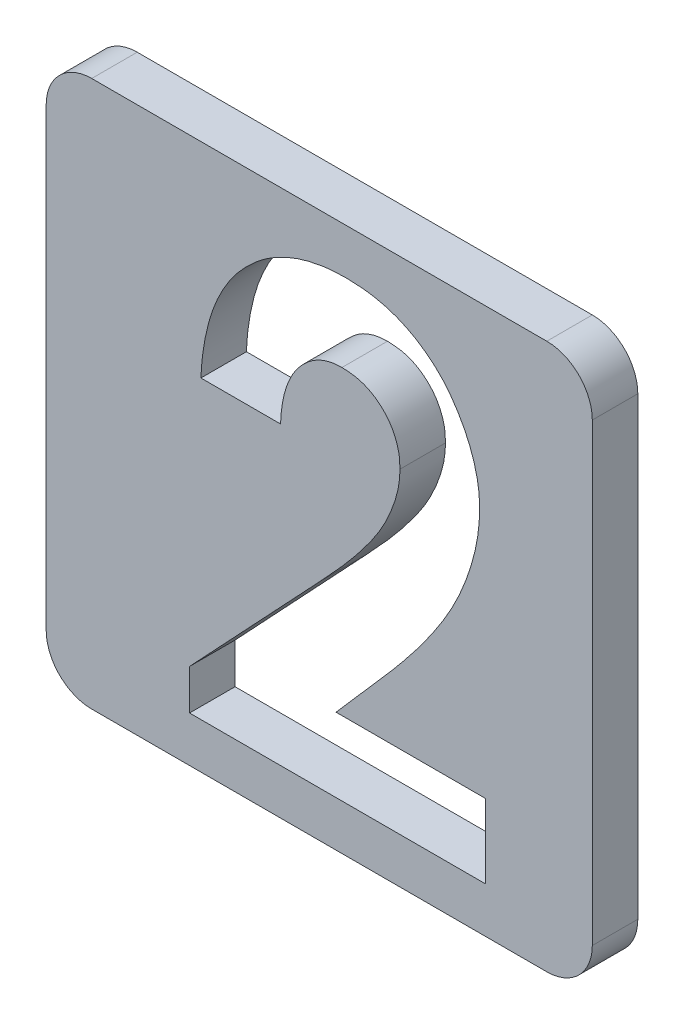
ISO-10303-21;
HEADER;
FILE_DESCRIPTION(('STEP AP214'),'2;1');
FILE_NAME('part.step','',(''),(''),'','','');
FILE_SCHEMA(('AUTOMOTIVE_DESIGN { 1 0 10303 214 1 1 1 1 }'));
ENDSEC;
DATA;
#1=APPLICATION_CONTEXT('core data for automotive mechanical design processes');
#2=APPLICATION_PROTOCOL_DEFINITION('international standard','automotive_design',2000,#1);
#3=PRODUCT_CONTEXT('',#1,'mechanical');
#4=PRODUCT('Part','Part','',(#3));
#5=PRODUCT_RELATED_PRODUCT_CATEGORY('part','',(#4));
#6=PRODUCT_DEFINITION_FORMATION('','',#4);
#7=PRODUCT_DEFINITION_CONTEXT('part definition',#1,'design');
#8=PRODUCT_DEFINITION('design','',#6,#7);
#9=PRODUCT_DEFINITION_SHAPE('','',#8);
#10=(LENGTH_UNIT() NAMED_UNIT(*) SI_UNIT(.MILLI.,.METRE.));
#11=(NAMED_UNIT(*) PLANE_ANGLE_UNIT() SI_UNIT($,.RADIAN.));
#12=(NAMED_UNIT(*) SI_UNIT($,.STERADIAN.) SOLID_ANGLE_UNIT());
#13=UNCERTAINTY_MEASURE_WITH_UNIT(LENGTH_MEASURE(1.E-05),#10,'distance_accuracy_value','');
#14=(GEOMETRIC_REPRESENTATION_CONTEXT(3) GLOBAL_UNCERTAINTY_ASSIGNED_CONTEXT((#13)) GLOBAL_UNIT_ASSIGNED_CONTEXT((#10,
#11,#12)) REPRESENTATION_CONTEXT('',''));
#15=CARTESIAN_POINT('',(0.,0.,0.));
#16=DIRECTION('',(0.,0.,1.));
#17=DIRECTION('',(1.,0.,0.));
#18=AXIS2_PLACEMENT_3D('',#15,#16,#17);
#19=CARTESIAN_POINT('',(50.,50.,10.));
#20=DIRECTION('',(0.,0.,-1.));
#21=DIRECTION('',(-1.,0.,0.));
#22=AXIS2_PLACEMENT_3D('',#19,#20,#21);
#23=PLANE('',#22);
#24=DIRECTION('',(1.,0.,0.));
#25=VECTOR('',#24,1.);
#26=CARTESIAN_POINT('',(-49.9999999999999,60.,10.));
#27=LINE('',#26,#25);
#28=CARTESIAN_POINT('',(-49.9999999999999,60.,10.));
#29=VERTEX_POINT('',#28);
#30=CARTESIAN_POINT('',(49.9999999999999,60.,10.));
#31=VERTEX_POINT('',#30);
#32=EDGE_CURVE('E293',#29,#31,#27,.T.);
#33=ORIENTED_EDGE('',*,*,#32,.F.);
#34=CARTESIAN_POINT('',(-50.,50.,10.));
#35=DIRECTION('',(0.,0.,1.));
#36=DIRECTION('',(1.,0.,0.));
#37=AXIS2_PLACEMENT_3D('',#34,#35,#36);
#38=CIRCLE('',#37,10.);
#39=CARTESIAN_POINT('',(-60.,49.9999999999999,10.));
#40=VERTEX_POINT('',#39);
#41=EDGE_CURVE('E280',#29,#40,#38,.T.);
#42=ORIENTED_EDGE('',*,*,#41,.T.);
#43=DIRECTION('',(0.,-1.,0.));
#44=VECTOR('',#43,1.);
#45=CARTESIAN_POINT('',(-60.,49.9999999999999,10.));
#46=LINE('',#45,#44);
#47=CARTESIAN_POINT('',(-60.,-49.9999999999999,10.));
#48=VERTEX_POINT('',#47);
#49=EDGE_CURVE('E308',#40,#48,#46,.T.);
#50=ORIENTED_EDGE('',*,*,#49,.T.);
#51=CARTESIAN_POINT('',(-50.,-50.,10.));
#52=DIRECTION('',(0.,0.,1.));
#53=DIRECTION('',(1.,0.,0.));
#54=AXIS2_PLACEMENT_3D('',#51,#52,#53);
#55=CIRCLE('',#54,10.);
#56=CARTESIAN_POINT('',(-49.9999999999999,-60.,10.));
#57=VERTEX_POINT('',#56);
#58=EDGE_CURVE('E312',#48,#57,#55,.T.);
#59=ORIENTED_EDGE('',*,*,#58,.T.);
#60=DIRECTION('',(1.,0.,0.));
#61=VECTOR('',#60,1.);
#62=CARTESIAN_POINT('',(-49.9999999999999,-60.,10.));
#63=LINE('',#62,#61);
#64=CARTESIAN_POINT('',(49.9999999999999,-60.,10.));
#65=VERTEX_POINT('',#64);
#66=EDGE_CURVE('E315',#57,#65,#63,.T.);
#67=ORIENTED_EDGE('',*,*,#66,.T.);
#68=CARTESIAN_POINT('',(50.,-50.,10.));
#69=DIRECTION('',(0.,0.,1.));
#70=DIRECTION('',(1.,0.,0.));
#71=AXIS2_PLACEMENT_3D('',#68,#69,#70);
#72=CIRCLE('',#71,10.);
#73=CARTESIAN_POINT('',(60.,-50.,10.));
#74=VERTEX_POINT('',#73);
#75=EDGE_CURVE('E319',#65,#74,#72,.T.);
#76=ORIENTED_EDGE('',*,*,#75,.T.);
#77=DIRECTION('',(0.,-1.,0.));
#78=VECTOR('',#77,1.);
#79=CARTESIAN_POINT('',(60.,49.9999999999999,10.));
#80=LINE('',#79,#78);
#81=CARTESIAN_POINT('',(60.,49.9999999999999,10.));
#82=VERTEX_POINT('',#81);
#83=EDGE_CURVE('E321',#82,#74,#80,.T.);
#84=ORIENTED_EDGE('',*,*,#83,.F.);
#85=CARTESIAN_POINT('',(50.,50.,10.));
#86=DIRECTION('',(0.,0.,-1.));
#87=DIRECTION('',(-1.,0.,0.));
#88=AXIS2_PLACEMENT_3D('',#85,#86,#87);
#89=CIRCLE('',#88,10.);
#90=EDGE_CURVE('E324',#31,#82,#89,.T.);
#91=ORIENTED_EDGE('',*,*,#90,.F.);
#92=EDGE_LOOP('',(#33,#42,#50,#59,#67,#76,#84,#91));
#93=FACE_BOUND('',#92,.T.);
#94=CARTESIAN_POINT('',(4.99609375,32.5,10.));
#95=CARTESIAN_POINT('',(4.53312483436699,32.4836250197315,10.));
#96=CARTESIAN_POINT('',(3.62169617498065,32.451388241387,10.));
#97=CARTESIAN_POINT('',(2.28196728534199,32.2367967300344,10.));
#98=CARTESIAN_POINT('',(1.00711899457204,31.8586015906494,10.));
#99=CARTESIAN_POINT('',(-0.217038468215524,31.3518733346072,10.));
#100=CARTESIAN_POINT('',(-1.37744057242677,30.680201393142,10.));
#101=CARTESIAN_POINT('',(-2.47116041632915,29.8522587146512,10.));
#102=CARTESIAN_POINT('',(-3.5097217204736,28.8890852036434,10.));
#103=CARTESIAN_POINT('',(-4.48836122605921,27.7936925758525,10.));
#104=CARTESIAN_POINT('',(-5.3790509329746,26.5712340817525,10.));
#105=CARTESIAN_POINT('',(-6.17015827377722,25.2328743797815,10.));
#106=CARTESIAN_POINT('',(-6.82427234510946,23.7794442295601,10.));
#107=CARTESIAN_POINT('',(-7.4001781477211,22.2301311290651,10.));
#108=CARTESIAN_POINT('',(-7.84434426039038,20.568294192624,10.));
#109=CARTESIAN_POINT('',(-8.16775229100981,18.8038793287482,10.));
#110=CARTESIAN_POINT('',(-8.41361781946333,16.939757009579,10.));
#111=CARTESIAN_POINT('',(-8.47068212505859,15.6583482041116,10.));
#112=CARTESIAN_POINT('',(-8.5,15.,10.));
#113=B_SPLINE_CURVE_WITH_KNOTS('',3,(#94,#95,#96,#97,#98,#99,#100,#101,#102,#103,#104,#105,#106,
#107,#108,#109,#110,#111,#112),.UNSPECIFIED.,.F.,.F.,(4,1,1,1,1,1,1,1,1,1,1,1,1,1,1,1,4),(0.,
0.0564668684718626,0.111164098696963,0.164937096875985,0.218321752312594,0.272392923248277,
0.327976343447704,0.385291051984021,0.444902918292819,0.506843819219835,0.569488185262968,
0.634153215553722,0.70097609531005,0.770897496846268,0.843625610555779,0.91965967611554,1.),.UNSPECIFIED.);
#114=CARTESIAN_POINT('',(4.99609375,32.5,10.));
#115=VERTEX_POINT('',#114);
#116=CARTESIAN_POINT('',(-8.5,15.,10.));
#117=VERTEX_POINT('',#116);
#118=EDGE_CURVE('E49',#115,#117,#113,.T.);
#119=ORIENTED_EDGE('',*,*,#118,.T.);
#120=DIRECTION('',(-1.,0.,0.));
#121=VECTOR('',#120,1.);
#122=CARTESIAN_POINT('',(-8.5,15.,10.));
#123=LINE('',#122,#121);
#124=CARTESIAN_POINT('',(-26.,15.,10.));
#125=VERTEX_POINT('',#124);
#126=EDGE_CURVE('E191',#117,#125,#123,.T.);
#127=ORIENTED_EDGE('',*,*,#126,.T.);
#128=CARTESIAN_POINT('',(-26.,15.,10.));
#129=CARTESIAN_POINT('',(-25.9244201838948,16.3237824174447,10.));
#130=CARTESIAN_POINT('',(-25.7767417610058,18.9103737817913,10.));
#131=CARTESIAN_POINT('',(-25.1893143204155,22.6674805607774,10.));
#132=CARTESIAN_POINT('',(-24.4021817098028,26.2175333190287,10.));
#133=CARTESIAN_POINT('',(-23.3516487477795,29.5481135851914,10.));
#134=CARTESIAN_POINT('',(-22.0315853430169,32.6580111334457,10.));
#135=CARTESIAN_POINT('',(-20.4759601281893,35.5578277739389,10.));
#136=CARTESIAN_POINT('',(-18.6450304131101,38.2322959078053,10.));
#137=CARTESIAN_POINT('',(-16.5777644037318,40.6685177399648,10.));
#138=CARTESIAN_POINT('',(-14.3092585900131,42.854074826766,10.));
#139=CARTESIAN_POINT('',(-11.8866093801282,44.7919270427031,10.));
#140=CARTESIAN_POINT('',(-9.272759089537,46.3909939220441,10.));
#141=CARTESIAN_POINT('',(-6.51546490133519,47.7068779195031,10.));
#142=CARTESIAN_POINT('',(-3.61519632583338,48.758208086899,10.));
#143=CARTESIAN_POINT('',(-0.544512266921413,49.461107381337,10.));
#144=CARTESIAN_POINT('',(2.66999962997469,49.9371176692899,10.));
#145=CARTESIAN_POINT('',(4.87059332603872,49.9787704794163,10.));
#146=CARTESIAN_POINT('',(5.9921875,50.,10.));
#147=B_SPLINE_CURVE_WITH_KNOTS('',3,(#128,#129,#130,#131,#132,#133,#134,#135,#136,#137,#138,
#139,#140,#141,#142,#143,#144,#145,#146),.UNSPECIFIED.,.F.,.F.,(4,1,1,1,1,1,1,1,1,1,1,1,1,1,1,1,
4),(0.,0.0749399102007728,0.146428085171576,0.214752971635919,0.280421536691247,
0.343604429519364,0.405542638818658,0.466199461930776,0.526538144824467,0.585901906309209,
0.644089574615792,0.701613075988366,0.758753587436571,0.816629449389766,0.875655474955304,
0.936624332286529,1.),.UNSPECIFIED.);
#148=CARTESIAN_POINT('',(5.9921875,50.,10.));
#149=VERTEX_POINT('',#148);
#150=EDGE_CURVE('E395',#125,#149,#147,.T.);
#151=ORIENTED_EDGE('',*,*,#150,.T.);
#152=CARTESIAN_POINT('',(5.9921875,50.,10.));
#153=CARTESIAN_POINT('',(7.36892843702883,49.9570420533656,10.));
#154=CARTESIAN_POINT('',(10.0566493814116,49.8731780744633,10.));
#155=CARTESIAN_POINT('',(13.9621211018767,49.1577905016013,10.));
#156=CARTESIAN_POINT('',(17.6094046777332,47.9611942367335,10.));
#157=CARTESIAN_POINT('',(20.9958488764451,46.2892336835994,10.));
#158=CARTESIAN_POINT('',(24.092624303042,44.1651830634176,10.));
#159=CARTESIAN_POINT('',(26.8992174279697,41.6326003241456,10.));
#160=CARTESIAN_POINT('',(29.3307523999783,38.6383505516809,10.));
#161=CARTESIAN_POINT('',(31.4026458651189,35.3070195932474,10.));
#162=CARTESIAN_POINT('',(33.1241417111022,31.7796089532212,10.));
#163=CARTESIAN_POINT('',(34.330494291396,28.1321200759099,10.));
#164=CARTESIAN_POINT('',(35.1234168588561,24.461342526559,10.));
#165=CARTESIAN_POINT('',(35.2079869582626,21.9896267220475,10.));
#166=CARTESIAN_POINT('',(35.25,20.76171875,10.));
#167=B_SPLINE_CURVE_WITH_KNOTS('',3,(#152,#153,#154,#155,#156,#157,#158,#159,#160,#161,#162,
#163,#164,#165,#166),.UNSPECIFIED.,.F.,.F.,(4,1,1,1,1,1,1,1,1,1,1,1,4),(0.,0.0896145288821155,
0.174948561286526,0.257548125874566,0.338900787490094,0.420053185883191,0.501401427119362,
0.584252026715958,0.670370476728631,0.756473266658252,0.839206594049849,0.920120466657821,1.),.UNSPECIFIED.);
#168=CARTESIAN_POINT('',(35.25,20.76171875,10.));
#169=VERTEX_POINT('',#168);
#170=EDGE_CURVE('E387',#149,#169,#167,.T.);
#171=ORIENTED_EDGE('',*,*,#170,.T.);
#172=CARTESIAN_POINT('',(35.25,20.76171875,10.));
#173=CARTESIAN_POINT('',(35.2336423402694,20.0189932239855,10.));
#174=CARTESIAN_POINT('',(35.2007184117788,18.524070202645,10.));
#175=CARTESIAN_POINT('',(34.9717939620203,16.2618847653599,10.));
#176=CARTESIAN_POINT('',(34.628362051844,13.9575844148353,10.));
#177=CARTESIAN_POINT('',(34.1105504260793,11.6131448738607,10.));
#178=CARTESIAN_POINT('',(33.4647968776838,9.22790895909238,10.));
#179=CARTESIAN_POINT('',(32.6814044865962,6.79473847926967,10.));
#180=CARTESIAN_POINT('',(31.7422016956116,4.32742861891873,10.));
#181=CARTESIAN_POINT('',(30.6628618925235,1.79821022753737,10.));
#182=CARTESIAN_POINT('',(29.37520677196,-0.80112807632517,10.));
#183=CARTESIAN_POINT('',(27.8759113685736,-3.50955138620133,10.));
#184=CARTESIAN_POINT('',(26.1251809848804,-6.32465711728382,10.));
#185=CARTESIAN_POINT('',(24.1441622357762,-9.26234027329181,10.));
#186=CARTESIAN_POINT('',(21.923233788697,-12.3179676729329,10.));
#187=CARTESIAN_POINT('',(19.4515538039887,-15.4823348129091,10.));
#188=CARTESIAN_POINT('',(16.7575902308361,-18.7665919133409,10.));
#189=CARTESIAN_POINT('',(14.8456084980727,-20.9619334774711,10.));
#190=CARTESIAN_POINT('',(13.86328125,-22.08984375,10.));
#191=B_SPLINE_CURVE_WITH_KNOTS('',3,(#172,#173,#174,#175,#176,#177,#178,#179,#180,#181,#182,
#183,#184,#185,#186,#187,#188,#189,#190),.UNSPECIFIED.,.F.,.F.,(4,1,1,1,1,1,1,1,1,1,1,1,1,1,1,1,
4),(0.,0.045517751651318,0.0916159906181652,0.139246555033572,0.188241563723404,
0.238673079372537,0.290663874320642,0.344839855578633,0.400431606735177,0.459143717613294,
0.522551047594614,0.590100858323045,0.662259656524867,0.739681307001257,0.821575471385422,
0.908330046684445,1.),.UNSPECIFIED.);
#192=CARTESIAN_POINT('',(13.86328125,-22.08984375,10.));
#193=VERTEX_POINT('',#192);
#194=EDGE_CURVE('E382',#169,#193,#191,.T.);
#195=ORIENTED_EDGE('',*,*,#194,.T.);
#196=DIRECTION('',(-0.657521221138536,-0.753436024989839,0.));
#197=VECTOR('',#196,1.);
#198=CARTESIAN_POINT('',(13.86328125,-22.08984375,10.));
#199=LINE('',#198,#197);
#200=CARTESIAN_POINT('',(3.6875,-33.75,10.));
#201=VERTEX_POINT('',#200);
#202=EDGE_CURVE('E379',#193,#201,#199,.T.);
#203=ORIENTED_EDGE('',*,*,#202,.T.);
#204=DIRECTION('',(1.,0.,0.));
#205=VECTOR('',#204,1.);
#206=CARTESIAN_POINT('',(3.6875,-33.75,10.));
#207=LINE('',#206,#205);
#208=CARTESIAN_POINT('',(36.5,-33.75,10.));
#209=VERTEX_POINT('',#208);
#210=EDGE_CURVE('E376',#201,#209,#207,.T.);
#211=ORIENTED_EDGE('',*,*,#210,.T.);
#212=DIRECTION('',(0.,-1.,0.));
#213=VECTOR('',#212,1.);
#214=CARTESIAN_POINT('',(36.5,-33.75,10.));
#215=LINE('',#214,#213);
#216=CARTESIAN_POINT('',(36.5,-50.,10.));
#217=VERTEX_POINT('',#216);
#218=EDGE_CURVE('E373',#209,#217,#215,.T.);
#219=ORIENTED_EDGE('',*,*,#218,.T.);
#220=DIRECTION('',(-1.,0.,0.));
#221=VECTOR('',#220,1.);
#222=CARTESIAN_POINT('',(36.5,-50.,10.));
#223=LINE('',#222,#221);
#224=CARTESIAN_POINT('',(-28.5,-50.,10.));
#225=VERTEX_POINT('',#224);
#226=EDGE_CURVE('E370',#217,#225,#223,.T.);
#227=ORIENTED_EDGE('',*,*,#226,.T.);
#228=DIRECTION('',(0.,1.,0.));
#229=VECTOR('',#228,1.);
#230=CARTESIAN_POINT('',(-28.5,-50.,10.));
#231=LINE('',#230,#229);
#232=CARTESIAN_POINT('',(-28.5,-41.1328125,10.));
#233=VERTEX_POINT('',#232);
#234=EDGE_CURVE('E367',#225,#233,#231,.T.);
#235=ORIENTED_EDGE('',*,*,#234,.T.);
#236=DIRECTION('',(0.684757495338255,0.728771001466222,0.));
#237=VECTOR('',#236,1.);
#238=CARTESIAN_POINT('',(-28.5,-41.1328125,10.));
#239=LINE('',#238,#237);
#240=CARTESIAN_POINT('',(0.367187499999998,-10.41015625,10.));
#241=VERTEX_POINT('',#240);
#242=EDGE_CURVE('E361',#233,#241,#239,.T.);
#243=ORIENTED_EDGE('',*,*,#242,.T.);
#244=CARTESIAN_POINT('',(0.367187499999998,-10.41015625,10.));
#245=CARTESIAN_POINT('',(1.20296676025005,-9.51396682711943,10.));
#246=CARTESIAN_POINT('',(2.82162333350582,-7.77831368373571,10.));
#247=CARTESIAN_POINT('',(5.12480482587024,-5.22932239180206,10.));
#248=CARTESIAN_POINT('',(7.20898062480664,-2.81039049938741,10.));
#249=CARTESIAN_POINT('',(9.03093365008162,-0.495761261650333,10.));
#250=CARTESIAN_POINT('',(10.6862776509911,1.63948816827424,10.));
#251=CARTESIAN_POINT('',(12.1012009685238,3.65971687285558,10.));
#252=CARTESIAN_POINT('',(13.288649043298,5.54666125691947,10.));
#253=CARTESIAN_POINT('',(14.5777923465723,7.82198663210792,10.));
#254=CARTESIAN_POINT('',(15.8020547136892,10.5357170342425,10.));
#255=CARTESIAN_POINT('',(16.9253895316952,13.6620457284737,10.));
#256=CARTESIAN_POINT('',(17.6101398399531,16.6500959483896,10.));
#257=CARTESIAN_POINT('',(17.7046570373391,18.5971737016553,10.));
#258=CARTESIAN_POINT('',(17.75,19.53125,10.));
#259=B_SPLINE_CURVE_WITH_KNOTS('',3,(#244,#245,#246,#247,#248,#249,#250,#251,#252,#253,#254,
#255,#256,#257,#258),.UNSPECIFIED.,.F.,.F.,(4,1,1,1,1,1,1,1,1,1,1,1,4),(0.,0.10384392426342,
0.201114885946524,0.291115719379218,0.374348403971364,0.450707396185871,0.520040412016361,
0.583258322445337,0.639578299825326,0.741536509948268,0.835060048681736,0.920872960045834,1.),.UNSPECIFIED.);
#260=CARTESIAN_POINT('',(17.75,19.53125,10.));
#261=VERTEX_POINT('',#260);
#262=EDGE_CURVE('E353',#241,#261,#259,.T.);
#263=ORIENTED_EDGE('',*,*,#262,.T.);
#264=CARTESIAN_POINT('',(17.75,19.53125,10.));
#265=CARTESIAN_POINT('',(17.716098162416,20.4348967553942,10.));
#266=CARTESIAN_POINT('',(17.6504079167401,22.1858572223297,10.));
#267=CARTESIAN_POINT('',(16.9285253462675,24.676589164035,10.));
#268=CARTESIAN_POINT('',(15.8101598307692,26.9316926783722,10.));
#269=CARTESIAN_POINT('',(14.234224873249,28.8837827294803,10.));
#270=CARTESIAN_POINT('',(12.3252740621026,30.4879445662169,10.));
#271=CARTESIAN_POINT('',(10.1193020846507,31.6810750721486,10.));
#272=CARTESIAN_POINT('',(7.63429410135949,32.3695059053874,10.));
#273=CARTESIAN_POINT('',(5.8922561584983,32.4556728502206,10.));
#274=CARTESIAN_POINT('',(4.99609375,32.5,10.));
#275=B_SPLINE_CURVE_WITH_KNOTS('',3,(#264,#265,#266,#267,#268,#269,#270,#271,#272,#273,#274),
.UNSPECIFIED.,.F.,.F.,(4,1,1,1,1,1,1,1,4),(0.,0.132754871747588,0.257233848111065,
0.378600731676354,0.501406277498453,0.623941953646954,0.743641834874646,0.868120811238123,1.),.UNSPECIFIED.);
#276=EDGE_CURVE('E185',#261,#115,#275,.T.);
#277=ORIENTED_EDGE('',*,*,#276,.T.);
#278=EDGE_LOOP('',(#119,#127,#151,#171,#195,#203,#211,#219,#227,#235,#243,#263,#277));
#279=FACE_BOUND('',#278,.T.);
#280=ADVANCED_FACE('F32',(#93,#279),#23,.F.);
#281=CARTESIAN_POINT('',(50.,50.,0.));
#282=DIRECTION('',(0.,0.,-1.));
#283=DIRECTION('',(-1.,0.,0.));
#284=AXIS2_PLACEMENT_3D('',#281,#282,#283);
#285=PLANE('',#284);
#286=DIRECTION('',(1.,0.,0.));
#287=VECTOR('',#286,1.);
#288=CARTESIAN_POINT('',(-49.9999999999999,60.,0.));
#289=LINE('',#288,#287);
#290=CARTESIAN_POINT('',(-49.9999999999999,60.,0.));
#291=VERTEX_POINT('',#290);
#292=CARTESIAN_POINT('',(49.9999999999999,60.,0.));
#293=VERTEX_POINT('',#292);
#294=EDGE_CURVE('E192',#291,#293,#289,.T.);
#295=ORIENTED_EDGE('',*,*,#294,.T.);
#296=CARTESIAN_POINT('',(50.,50.,0.));
#297=DIRECTION('',(0.,0.,-1.));
#298=DIRECTION('',(-1.,0.,0.));
#299=AXIS2_PLACEMENT_3D('',#296,#297,#298);
#300=CIRCLE('',#299,10.);
#301=CARTESIAN_POINT('',(60.,49.9999999999999,0.));
#302=VERTEX_POINT('',#301);
#303=EDGE_CURVE('E264',#293,#302,#300,.T.);
#304=ORIENTED_EDGE('',*,*,#303,.T.);
#305=DIRECTION('',(0.,-1.,0.));
#306=VECTOR('',#305,1.);
#307=CARTESIAN_POINT('',(60.,49.9999999999999,0.));
#308=LINE('',#307,#306);
#309=CARTESIAN_POINT('',(60.,-50.,0.));
#310=VERTEX_POINT('',#309);
#311=EDGE_CURVE('E271',#302,#310,#308,.T.);
#312=ORIENTED_EDGE('',*,*,#311,.T.);
#313=CARTESIAN_POINT('',(50.,-50.,0.));
#314=DIRECTION('',(0.,0.,1.));
#315=DIRECTION('',(1.,0.,0.));
#316=AXIS2_PLACEMENT_3D('',#313,#314,#315);
#317=CIRCLE('',#316,10.);
#318=CARTESIAN_POINT('',(49.9999999999999,-60.,0.));
#319=VERTEX_POINT('',#318);
#320=EDGE_CURVE('E284',#319,#310,#317,.T.);
#321=ORIENTED_EDGE('',*,*,#320,.F.);
#322=DIRECTION('',(1.,0.,0.));
#323=VECTOR('',#322,1.);
#324=CARTESIAN_POINT('',(-49.9999999999999,-60.,0.));
#325=LINE('',#324,#323);
#326=CARTESIAN_POINT('',(-49.9999999999999,-60.,0.));
#327=VERTEX_POINT('',#326);
#328=EDGE_CURVE('E287',#327,#319,#325,.T.);
#329=ORIENTED_EDGE('',*,*,#328,.F.);
#330=CARTESIAN_POINT('',(-50.,-50.,0.));
#331=DIRECTION('',(0.,0.,1.));
#332=DIRECTION('',(1.,0.,0.));
#333=AXIS2_PLACEMENT_3D('',#330,#331,#332);
#334=CIRCLE('',#333,10.);
#335=CARTESIAN_POINT('',(-60.,-49.9999999999999,0.));
#336=VERTEX_POINT('',#335);
#337=EDGE_CURVE('E289',#336,#327,#334,.T.);
#338=ORIENTED_EDGE('',*,*,#337,.F.);
#339=DIRECTION('',(0.,-1.,0.));
#340=VECTOR('',#339,1.);
#341=CARTESIAN_POINT('',(-60.,49.9999999999999,0.));
#342=LINE('',#341,#340);
#343=CARTESIAN_POINT('',(-60.,49.9999999999999,0.));
#344=VERTEX_POINT('',#343);
#345=EDGE_CURVE('E291',#344,#336,#342,.T.);
#346=ORIENTED_EDGE('',*,*,#345,.F.);
#347=CARTESIAN_POINT('',(-50.,50.,0.));
#348=DIRECTION('',(0.,0.,1.));
#349=DIRECTION('',(1.,0.,0.));
#350=AXIS2_PLACEMENT_3D('',#347,#348,#349);
#351=CIRCLE('',#350,10.);
#352=EDGE_CURVE('E276',#291,#344,#351,.T.);
#353=ORIENTED_EDGE('',*,*,#352,.F.);
#354=EDGE_LOOP('',(#295,#304,#312,#321,#329,#338,#346,#353));
#355=FACE_BOUND('',#354,.T.);
#356=DIRECTION('',(-1.,0.,0.));
#357=VECTOR('',#356,1.);
#358=CARTESIAN_POINT('',(-8.5,15.,0.));
#359=LINE('',#358,#357);
#360=CARTESIAN_POINT('',(-8.5,15.,0.));
#361=VERTEX_POINT('',#360);
#362=CARTESIAN_POINT('',(-26.,15.,0.));
#363=VERTEX_POINT('',#362);
#364=EDGE_CURVE('E184',#361,#363,#359,.T.);
#365=ORIENTED_EDGE('',*,*,#364,.F.);
#366=CARTESIAN_POINT('',(4.99609375,32.5,0.));
#367=CARTESIAN_POINT('',(4.53312483436699,32.4836250197315,0.));
#368=CARTESIAN_POINT('',(3.62169617498065,32.451388241387,0.));
#369=CARTESIAN_POINT('',(2.28196728534199,32.2367967300344,0.));
#370=CARTESIAN_POINT('',(1.00711899457204,31.8586015906494,0.));
#371=CARTESIAN_POINT('',(-0.217038468215524,31.3518733346072,0.));
#372=CARTESIAN_POINT('',(-1.37744057242677,30.680201393142,0.));
#373=CARTESIAN_POINT('',(-2.47116041632915,29.8522587146512,0.));
#374=CARTESIAN_POINT('',(-3.5097217204736,28.8890852036434,0.));
#375=CARTESIAN_POINT('',(-4.48836122605921,27.7936925758525,0.));
#376=CARTESIAN_POINT('',(-5.3790509329746,26.5712340817525,0.));
#377=CARTESIAN_POINT('',(-6.17015827377722,25.2328743797815,0.));
#378=CARTESIAN_POINT('',(-6.82427234510946,23.7794442295601,0.));
#379=CARTESIAN_POINT('',(-7.4001781477211,22.2301311290651,0.));
#380=CARTESIAN_POINT('',(-7.84434426039038,20.568294192624,0.));
#381=CARTESIAN_POINT('',(-8.16775229100981,18.8038793287482,0.));
#382=CARTESIAN_POINT('',(-8.41361781946333,16.939757009579,0.));
#383=CARTESIAN_POINT('',(-8.47068212505859,15.6583482041116,0.));
#384=CARTESIAN_POINT('',(-8.5,15.,0.));
#385=B_SPLINE_CURVE_WITH_KNOTS('',3,(#366,#367,#368,#369,#370,#371,#372,#373,#374,#375,#376,
#377,#378,#379,#380,#381,#382,#383,#384),.UNSPECIFIED.,.F.,.F.,(4,1,1,1,1,1,1,1,1,1,1,1,1,1,1,1,
4),(0.,0.0564668684718626,0.111164098696963,0.164937096875985,0.218321752312594,
0.272392923248277,0.327976343447704,0.385291051984021,0.444902918292819,0.506843819219835,
0.569488185262968,0.634153215553722,0.70097609531005,0.770897496846268,0.843625610555779,
0.91965967611554,1.),.UNSPECIFIED.);
#386=CARTESIAN_POINT('',(4.99609375,32.5,0.));
#387=VERTEX_POINT('',#386);
#388=EDGE_CURVE('E176',#387,#361,#385,.T.);
#389=ORIENTED_EDGE('',*,*,#388,.F.);
#390=CARTESIAN_POINT('',(17.75,19.53125,0.));
#391=CARTESIAN_POINT('',(17.716098162416,20.4348967553942,0.));
#392=CARTESIAN_POINT('',(17.6504079167401,22.1858572223297,0.));
#393=CARTESIAN_POINT('',(16.9285253462675,24.676589164035,0.));
#394=CARTESIAN_POINT('',(15.8101598307692,26.9316926783722,0.));
#395=CARTESIAN_POINT('',(14.234224873249,28.8837827294803,0.));
#396=CARTESIAN_POINT('',(12.3252740621026,30.4879445662169,0.));
#397=CARTESIAN_POINT('',(10.1193020846507,31.6810750721486,0.));
#398=CARTESIAN_POINT('',(7.63429410135949,32.3695059053874,0.));
#399=CARTESIAN_POINT('',(5.8922561584983,32.4556728502206,0.));
#400=CARTESIAN_POINT('',(4.99609375,32.5,0.));
#401=B_SPLINE_CURVE_WITH_KNOTS('',3,(#390,#391,#392,#393,#394,#395,#396,#397,#398,#399,#400),
.UNSPECIFIED.,.F.,.F.,(4,1,1,1,1,1,1,1,4),(0.,0.132754871747588,0.257233848111065,
0.378600731676354,0.501406277498453,0.623941953646954,0.743641834874646,0.868120811238123,1.),.UNSPECIFIED.);
#402=CARTESIAN_POINT('',(17.75,19.53125,0.));
#403=VERTEX_POINT('',#402);
#404=EDGE_CURVE('E348',#403,#387,#401,.T.);
#405=ORIENTED_EDGE('',*,*,#404,.F.);
#406=CARTESIAN_POINT('',(0.367187499999998,-10.41015625,0.));
#407=CARTESIAN_POINT('',(1.20296676025005,-9.51396682711943,0.));
#408=CARTESIAN_POINT('',(2.82162333350582,-7.77831368373571,0.));
#409=CARTESIAN_POINT('',(5.12480482587024,-5.22932239180206,0.));
#410=CARTESIAN_POINT('',(7.20898062480664,-2.81039049938741,0.));
#411=CARTESIAN_POINT('',(9.03093365008162,-0.495761261650333,0.));
#412=CARTESIAN_POINT('',(10.6862776509911,1.63948816827424,0.));
#413=CARTESIAN_POINT('',(12.1012009685238,3.65971687285558,0.));
#414=CARTESIAN_POINT('',(13.288649043298,5.54666125691947,0.));
#415=CARTESIAN_POINT('',(14.5777923465723,7.82198663210792,0.));
#416=CARTESIAN_POINT('',(15.8020547136892,10.5357170342425,0.));
#417=CARTESIAN_POINT('',(16.9253895316952,13.6620457284737,0.));
#418=CARTESIAN_POINT('',(17.6101398399531,16.6500959483896,0.));
#419=CARTESIAN_POINT('',(17.7046570373391,18.5971737016553,0.));
#420=CARTESIAN_POINT('',(17.75,19.53125,0.));
#421=B_SPLINE_CURVE_WITH_KNOTS('',3,(#406,#407,#408,#409,#410,#411,#412,#413,#414,#415,#416,
#417,#418,#419,#420),.UNSPECIFIED.,.F.,.F.,(4,1,1,1,1,1,1,1,1,1,1,1,4),(0.,0.10384392426342,
0.201114885946524,0.291115719379218,0.374348403971364,0.450707396185871,0.520040412016361,
0.583258322445337,0.639578299825326,0.741536509948268,0.835060048681736,0.920872960045834,1.),.UNSPECIFIED.);
#422=CARTESIAN_POINT('',(0.367187499999998,-10.41015625,0.));
#423=VERTEX_POINT('',#422);
#424=EDGE_CURVE('E417',#423,#403,#421,.T.);
#425=ORIENTED_EDGE('',*,*,#424,.F.);
#426=DIRECTION('',(0.684757495338255,0.728771001466222,0.));
#427=VECTOR('',#426,1.);
#428=CARTESIAN_POINT('',(-28.5,-41.1328125,0.));
#429=LINE('',#428,#427);
#430=CARTESIAN_POINT('',(-28.5,-41.1328125,0.));
#431=VERTEX_POINT('',#430);
#432=EDGE_CURVE('E476',#431,#423,#429,.T.);
#433=ORIENTED_EDGE('',*,*,#432,.F.);
#434=DIRECTION('',(0.,1.,0.));
#435=VECTOR('',#434,1.);
#436=CARTESIAN_POINT('',(-28.5,-50.,0.));
#437=LINE('',#436,#435);
#438=CARTESIAN_POINT('',(-28.5,-50.,0.));
#439=VERTEX_POINT('',#438);
#440=EDGE_CURVE('E475',#439,#431,#437,.T.);
#441=ORIENTED_EDGE('',*,*,#440,.F.);
#442=DIRECTION('',(-1.,0.,0.));
#443=VECTOR('',#442,1.);
#444=CARTESIAN_POINT('',(36.5,-50.,0.));
#445=LINE('',#444,#443);
#446=CARTESIAN_POINT('',(36.5,-50.,0.));
#447=VERTEX_POINT('',#446);
#448=EDGE_CURVE('E473',#447,#439,#445,.T.);
#449=ORIENTED_EDGE('',*,*,#448,.F.);
#450=DIRECTION('',(0.,-1.,0.));
#451=VECTOR('',#450,1.);
#452=CARTESIAN_POINT('',(36.5,-33.75,0.));
#453=LINE('',#452,#451);
#454=CARTESIAN_POINT('',(36.5,-33.75,0.));
#455=VERTEX_POINT('',#454);
#456=EDGE_CURVE('E471',#455,#447,#453,.T.);
#457=ORIENTED_EDGE('',*,*,#456,.F.);
#458=DIRECTION('',(1.,0.,0.));
#459=VECTOR('',#458,1.);
#460=CARTESIAN_POINT('',(3.6875,-33.75,0.));
#461=LINE('',#460,#459);
#462=CARTESIAN_POINT('',(3.6875,-33.75,0.));
#463=VERTEX_POINT('',#462);
#464=EDGE_CURVE('E469',#463,#455,#461,.T.);
#465=ORIENTED_EDGE('',*,*,#464,.F.);
#466=DIRECTION('',(-0.657521221138536,-0.753436024989839,0.));
#467=VECTOR('',#466,1.);
#468=CARTESIAN_POINT('',(13.86328125,-22.08984375,0.));
#469=LINE('',#468,#467);
#470=CARTESIAN_POINT('',(13.86328125,-22.08984375,0.));
#471=VERTEX_POINT('',#470);
#472=EDGE_CURVE('E464',#471,#463,#469,.T.);
#473=ORIENTED_EDGE('',*,*,#472,.F.);
#474=CARTESIAN_POINT('',(35.25,20.76171875,0.));
#475=CARTESIAN_POINT('',(35.2336423402694,20.0189932239855,0.));
#476=CARTESIAN_POINT('',(35.2007184117788,18.524070202645,0.));
#477=CARTESIAN_POINT('',(34.9717939620203,16.2618847653599,0.));
#478=CARTESIAN_POINT('',(34.628362051844,13.9575844148353,0.));
#479=CARTESIAN_POINT('',(34.1105504260793,11.6131448738607,0.));
#480=CARTESIAN_POINT('',(33.4647968776838,9.22790895909238,0.));
#481=CARTESIAN_POINT('',(32.6814044865962,6.79473847926967,0.));
#482=CARTESIAN_POINT('',(31.7422016956116,4.32742861891873,0.));
#483=CARTESIAN_POINT('',(30.6628618925235,1.79821022753737,0.));
#484=CARTESIAN_POINT('',(29.37520677196,-0.80112807632517,0.));
#485=CARTESIAN_POINT('',(27.8759113685736,-3.50955138620133,0.));
#486=CARTESIAN_POINT('',(26.1251809848804,-6.32465711728382,0.));
#487=CARTESIAN_POINT('',(24.1441622357762,-9.26234027329181,0.));
#488=CARTESIAN_POINT('',(21.923233788697,-12.3179676729329,0.));
#489=CARTESIAN_POINT('',(19.4515538039887,-15.4823348129091,0.));
#490=CARTESIAN_POINT('',(16.7575902308361,-18.7665919133409,0.));
#491=CARTESIAN_POINT('',(14.8456084980727,-20.9619334774711,0.));
#492=CARTESIAN_POINT('',(13.86328125,-22.08984375,0.));
#493=B_SPLINE_CURVE_WITH_KNOTS('',3,(#474,#475,#476,#477,#478,#479,#480,#481,#482,#483,#484,
#485,#486,#487,#488,#489,#490,#491,#492),.UNSPECIFIED.,.F.,.F.,(4,1,1,1,1,1,1,1,1,1,1,1,1,1,1,1,
4),(0.,0.045517751651318,0.0916159906181652,0.139246555033572,0.188241563723404,
0.238673079372537,0.290663874320642,0.344839855578633,0.400431606735177,0.459143717613294,
0.522551047594614,0.590100858323045,0.662259656524867,0.739681307001257,0.821575471385422,
0.908330046684445,1.),.UNSPECIFIED.);
#494=CARTESIAN_POINT('',(35.25,20.76171875,0.));
#495=VERTEX_POINT('',#494);
#496=EDGE_CURVE('E459',#495,#471,#493,.T.);
#497=ORIENTED_EDGE('',*,*,#496,.F.);
#498=CARTESIAN_POINT('',(5.9921875,50.,0.));
#499=CARTESIAN_POINT('',(7.36892843702883,49.9570420533656,0.));
#500=CARTESIAN_POINT('',(10.0566493814116,49.8731780744633,0.));
#501=CARTESIAN_POINT('',(13.9621211018767,49.1577905016013,0.));
#502=CARTESIAN_POINT('',(17.6094046777332,47.9611942367335,0.));
#503=CARTESIAN_POINT('',(20.9958488764451,46.2892336835994,0.));
#504=CARTESIAN_POINT('',(24.092624303042,44.1651830634176,0.));
#505=CARTESIAN_POINT('',(26.8992174279697,41.6326003241456,0.));
#506=CARTESIAN_POINT('',(29.3307523999783,38.6383505516809,0.));
#507=CARTESIAN_POINT('',(31.4026458651189,35.3070195932474,0.));
#508=CARTESIAN_POINT('',(33.1241417111022,31.7796089532212,0.));
#509=CARTESIAN_POINT('',(34.330494291396,28.1321200759099,0.));
#510=CARTESIAN_POINT('',(35.1234168588561,24.461342526559,0.));
#511=CARTESIAN_POINT('',(35.2079869582626,21.9896267220475,0.));
#512=CARTESIAN_POINT('',(35.25,20.76171875,0.));
#513=B_SPLINE_CURVE_WITH_KNOTS('',3,(#498,#499,#500,#501,#502,#503,#504,#505,#506,#507,#508,
#509,#510,#511,#512),.UNSPECIFIED.,.F.,.F.,(4,1,1,1,1,1,1,1,1,1,1,1,4),(0.,0.0896145288821155,
0.174948561286526,0.257548125874566,0.338900787490094,0.420053185883191,0.501401427119362,
0.584252026715958,0.670370476728631,0.756473266658252,0.839206594049849,0.920120466657821,1.),.UNSPECIFIED.);
#514=CARTESIAN_POINT('',(5.9921875,50.,0.));
#515=VERTEX_POINT('',#514);
#516=EDGE_CURVE('E200',#515,#495,#513,.T.);
#517=ORIENTED_EDGE('',*,*,#516,.F.);
#518=CARTESIAN_POINT('',(-26.,15.,0.));
#519=CARTESIAN_POINT('',(-25.9244201838948,16.3237824174447,0.));
#520=CARTESIAN_POINT('',(-25.7767417610058,18.9103737817913,0.));
#521=CARTESIAN_POINT('',(-25.1893143204155,22.6674805607774,0.));
#522=CARTESIAN_POINT('',(-24.4021817098028,26.2175333190287,0.));
#523=CARTESIAN_POINT('',(-23.3516487477795,29.5481135851914,0.));
#524=CARTESIAN_POINT('',(-22.0315853430169,32.6580111334457,0.));
#525=CARTESIAN_POINT('',(-20.4759601281893,35.5578277739389,0.));
#526=CARTESIAN_POINT('',(-18.6450304131101,38.2322959078053,0.));
#527=CARTESIAN_POINT('',(-16.5777644037318,40.6685177399648,0.));
#528=CARTESIAN_POINT('',(-14.3092585900131,42.854074826766,0.));
#529=CARTESIAN_POINT('',(-11.8866093801282,44.7919270427031,0.));
#530=CARTESIAN_POINT('',(-9.272759089537,46.3909939220441,0.));
#531=CARTESIAN_POINT('',(-6.51546490133519,47.7068779195031,0.));
#532=CARTESIAN_POINT('',(-3.61519632583338,48.758208086899,0.));
#533=CARTESIAN_POINT('',(-0.544512266921413,49.461107381337,0.));
#534=CARTESIAN_POINT('',(2.66999962997469,49.9371176692899,0.));
#535=CARTESIAN_POINT('',(4.87059332603872,49.9787704794163,0.));
#536=CARTESIAN_POINT('',(5.9921875,50.,0.));
#537=B_SPLINE_CURVE_WITH_KNOTS('',3,(#518,#519,#520,#521,#522,#523,#524,#525,#526,#527,#528,
#529,#530,#531,#532,#533,#534,#535,#536),.UNSPECIFIED.,.F.,.F.,(4,1,1,1,1,1,1,1,1,1,1,1,1,1,1,1,
4),(0.,0.0749399102007728,0.146428085171576,0.214752971635919,0.280421536691247,
0.343604429519364,0.405542638818658,0.466199461930776,0.526538144824467,0.585901906309209,
0.644089574615792,0.701613075988366,0.758753587436571,0.816629449389766,0.875655474955304,
0.936624332286529,1.),.UNSPECIFIED.);
#538=EDGE_CURVE('E198',#363,#515,#537,.T.);
#539=ORIENTED_EDGE('',*,*,#538,.F.);
#540=EDGE_LOOP('',(#365,#389,#405,#425,#433,#441,#449,#457,#465,#473,#497,#517,#539));
#541=FACE_BOUND('',#540,.T.);
#542=ADVANCED_FACE('F196',(#355,#541),#285,.T.);
#543=CARTESIAN_POINT('',(-49.9999999999999,60.,10.));
#544=DIRECTION('',(0.,1.,0.));
#545=DIRECTION('',(0.,0.,1.));
#546=AXIS2_PLACEMENT_3D('',#543,#544,#545);
#547=PLANE('',#546);
#548=ORIENTED_EDGE('',*,*,#294,.F.);
#549=DIRECTION('',(0.,0.,-1.));
#550=VECTOR('',#549,1.);
#551=CARTESIAN_POINT('',(-49.9999999999999,60.,10.));
#552=LINE('',#551,#550);
#553=EDGE_CURVE('E11',#29,#291,#552,.T.);
#554=ORIENTED_EDGE('',*,*,#553,.F.);
#555=ORIENTED_EDGE('',*,*,#32,.T.);
#556=DIRECTION('',(0.,0.,-1.));
#557=VECTOR('',#556,1.);
#558=CARTESIAN_POINT('',(49.9999999999999,60.,10.));
#559=LINE('',#558,#557);
#560=EDGE_CURVE('E36',#31,#293,#559,.T.);
#561=ORIENTED_EDGE('',*,*,#560,.T.);
#562=EDGE_LOOP('',(#548,#554,#555,#561));
#563=FACE_BOUND('',#562,.T.);
#564=ADVANCED_FACE('F34',(#563),#547,.T.);
#565=CARTESIAN_POINT('',(-50.,50.,10.));
#566=DIRECTION('',(0.,0.,-1.));
#567=DIRECTION('',(-1.,0.,0.));
#568=AXIS2_PLACEMENT_3D('',#565,#566,#567);
#569=CYLINDRICAL_SURFACE('',#568,10.);
#570=ORIENTED_EDGE('',*,*,#352,.T.);
#571=DIRECTION('',(0.,0.,-1.));
#572=VECTOR('',#571,1.);
#573=CARTESIAN_POINT('',(-60.,49.9999999999999,10.));
#574=LINE('',#573,#572);
#575=EDGE_CURVE('E41',#40,#344,#574,.T.);
#576=ORIENTED_EDGE('',*,*,#575,.F.);
#577=ORIENTED_EDGE('',*,*,#41,.F.);
#578=ORIENTED_EDGE('',*,*,#553,.T.);
#579=EDGE_LOOP('',(#570,#576,#577,#578));
#580=FACE_BOUND('',#579,.T.);
#581=ADVANCED_FACE('F235',(#580),#569,.T.);
#582=CARTESIAN_POINT('',(-60.,49.9999999999999,10.));
#583=DIRECTION('',(1.,0.,0.));
#584=DIRECTION('',(0.,1.,0.));
#585=AXIS2_PLACEMENT_3D('',#582,#583,#584);
#586=PLANE('',#585);
#587=ORIENTED_EDGE('',*,*,#345,.T.);
#588=DIRECTION('',(0.,0.,-1.));
#589=VECTOR('',#588,1.);
#590=CARTESIAN_POINT('',(-60.,-49.9999999999999,10.));
#591=LINE('',#590,#589);
#592=EDGE_CURVE('E297',#48,#336,#591,.T.);
#593=ORIENTED_EDGE('',*,*,#592,.F.);
#594=ORIENTED_EDGE('',*,*,#49,.F.);
#595=ORIENTED_EDGE('',*,*,#575,.T.);
#596=EDGE_LOOP('',(#587,#593,#594,#595));
#597=FACE_BOUND('',#596,.T.);
#598=ADVANCED_FACE('F238',(#597),#586,.F.);
#599=CARTESIAN_POINT('',(-50.,-50.,10.));
#600=DIRECTION('',(0.,0.,-1.));
#601=DIRECTION('',(-1.,0.,0.));
#602=AXIS2_PLACEMENT_3D('',#599,#600,#601);
#603=CYLINDRICAL_SURFACE('',#602,10.);
#604=ORIENTED_EDGE('',*,*,#337,.T.);
#605=DIRECTION('',(0.,0.,-1.));
#606=VECTOR('',#605,1.);
#607=CARTESIAN_POINT('',(-49.9999999999999,-60.,10.));
#608=LINE('',#607,#606);
#609=EDGE_CURVE('E300',#57,#327,#608,.T.);
#610=ORIENTED_EDGE('',*,*,#609,.F.);
#611=ORIENTED_EDGE('',*,*,#58,.F.);
#612=ORIENTED_EDGE('',*,*,#592,.T.);
#613=EDGE_LOOP('',(#604,#610,#611,#612));
#614=FACE_BOUND('',#613,.T.);
#615=ADVANCED_FACE('F242',(#614),#603,.T.);
#616=CARTESIAN_POINT('',(-49.9999999999999,-60.,10.));
#617=DIRECTION('',(0.,1.,0.));
#618=DIRECTION('',(0.,0.,1.));
#619=AXIS2_PLACEMENT_3D('',#616,#617,#618);
#620=PLANE('',#619);
#621=ORIENTED_EDGE('',*,*,#328,.T.);
#622=DIRECTION('',(0.,0.,-1.));
#623=VECTOR('',#622,1.);
#624=CARTESIAN_POINT('',(49.9999999999999,-60.,10.));
#625=LINE('',#624,#623);
#626=EDGE_CURVE('E303',#65,#319,#625,.T.);
#627=ORIENTED_EDGE('',*,*,#626,.F.);
#628=ORIENTED_EDGE('',*,*,#66,.F.);
#629=ORIENTED_EDGE('',*,*,#609,.T.);
#630=EDGE_LOOP('',(#621,#627,#628,#629));
#631=FACE_BOUND('',#630,.T.);
#632=ADVANCED_FACE('F246',(#631),#620,.F.);
#633=CARTESIAN_POINT('',(50.,-50.,10.));
#634=DIRECTION('',(0.,0.,-1.));
#635=DIRECTION('',(-1.,0.,0.));
#636=AXIS2_PLACEMENT_3D('',#633,#634,#635);
#637=CYLINDRICAL_SURFACE('',#636,10.);
#638=ORIENTED_EDGE('',*,*,#320,.T.);
#639=DIRECTION('',(0.,0.,-1.));
#640=VECTOR('',#639,1.);
#641=CARTESIAN_POINT('',(60.,-50.,10.));
#642=LINE('',#641,#640);
#643=EDGE_CURVE('E306',#74,#310,#642,.T.);
#644=ORIENTED_EDGE('',*,*,#643,.F.);
#645=ORIENTED_EDGE('',*,*,#75,.F.);
#646=ORIENTED_EDGE('',*,*,#626,.T.);
#647=EDGE_LOOP('',(#638,#644,#645,#646));
#648=FACE_BOUND('',#647,.T.);
#649=ADVANCED_FACE('F250',(#648),#637,.T.);
#650=CARTESIAN_POINT('',(60.,49.9999999999999,10.));
#651=DIRECTION('',(1.,0.,0.));
#652=DIRECTION('',(0.,1.,0.));
#653=AXIS2_PLACEMENT_3D('',#650,#651,#652);
#654=PLANE('',#653);
#655=ORIENTED_EDGE('',*,*,#311,.F.);
#656=DIRECTION('',(0.,0.,-1.));
#657=VECTOR('',#656,1.);
#658=CARTESIAN_POINT('',(60.,49.9999999999999,10.));
#659=LINE('',#658,#657);
#660=EDGE_CURVE('E268',#82,#302,#659,.T.);
#661=ORIENTED_EDGE('',*,*,#660,.F.);
#662=ORIENTED_EDGE('',*,*,#83,.T.);
#663=ORIENTED_EDGE('',*,*,#643,.T.);
#664=EDGE_LOOP('',(#655,#661,#662,#663));
#665=FACE_BOUND('',#664,.T.);
#666=ADVANCED_FACE('F254',(#665),#654,.T.);
#667=CARTESIAN_POINT('',(50.,50.,10.));
#668=DIRECTION('',(0.,0.,-1.));
#669=DIRECTION('',(-1.,0.,0.));
#670=AXIS2_PLACEMENT_3D('',#667,#668,#669);
#671=CYLINDRICAL_SURFACE('',#670,10.);
#672=ORIENTED_EDGE('',*,*,#303,.F.);
#673=ORIENTED_EDGE('',*,*,#560,.F.);
#674=ORIENTED_EDGE('',*,*,#90,.T.);
#675=ORIENTED_EDGE('',*,*,#660,.T.);
#676=EDGE_LOOP('',(#672,#673,#674,#675));
#677=FACE_BOUND('',#676,.T.);
#678=ADVANCED_FACE('F228',(#677),#671,.T.);
#679=DIRECTION('',(0.,0.,1.));
#680=VECTOR('',#679,1.);
#681=SURFACE_OF_LINEAR_EXTRUSION('',#385,#680);
#682=ORIENTED_EDGE('',*,*,#118,.F.);
#683=DIRECTION('',(0.,0.,1.));
#684=VECTOR('',#683,1.);
#685=CARTESIAN_POINT('',(4.99609375,32.5,0.));
#686=LINE('',#685,#684);
#687=EDGE_CURVE('E180',#387,#115,#686,.T.);
#688=ORIENTED_EDGE('',*,*,#687,.F.);
#689=ORIENTED_EDGE('',*,*,#388,.T.);
#690=DIRECTION('',(0.,0.,1.));
#691=VECTOR('',#690,1.);
#692=CARTESIAN_POINT('',(-8.5,15.,0.));
#693=LINE('',#692,#691);
#694=EDGE_CURVE('E179',#361,#117,#693,.T.);
#695=ORIENTED_EDGE('',*,*,#694,.T.);
#696=EDGE_LOOP('',(#682,#688,#689,#695));
#697=FACE_BOUND('',#696,.T.);
#698=ADVANCED_FACE('F178',(#697),#681,.T.);
#699=CARTESIAN_POINT('',(-8.5,15.,0.));
#700=DIRECTION('',(0.,1.,0.));
#701=DIRECTION('',(0.,0.,1.));
#702=AXIS2_PLACEMENT_3D('',#699,#700,#701);
#703=PLANE('',#702);
#704=ORIENTED_EDGE('',*,*,#126,.F.);
#705=ORIENTED_EDGE('',*,*,#694,.F.);
#706=ORIENTED_EDGE('',*,*,#364,.T.);
#707=DIRECTION('',(0.,0.,1.));
#708=VECTOR('',#707,1.);
#709=CARTESIAN_POINT('',(-26.,15.,0.));
#710=LINE('',#709,#708);
#711=EDGE_CURVE('E193',#363,#125,#710,.T.);
#712=ORIENTED_EDGE('',*,*,#711,.T.);
#713=EDGE_LOOP('',(#704,#705,#706,#712));
#714=FACE_BOUND('',#713,.T.);
#715=ADVANCED_FACE('F188',(#714),#703,.T.);
#716=DIRECTION('',(0.,0.,1.));
#717=VECTOR('',#716,1.);
#718=SURFACE_OF_LINEAR_EXTRUSION('',#537,#717);
#719=ORIENTED_EDGE('',*,*,#150,.F.);
#720=ORIENTED_EDGE('',*,*,#711,.F.);
#721=ORIENTED_EDGE('',*,*,#538,.T.);
#722=DIRECTION('',(0.,0.,1.));
#723=VECTOR('',#722,1.);
#724=CARTESIAN_POINT('',(5.9921875,50.,0.));
#725=LINE('',#724,#723);
#726=EDGE_CURVE('E328',#515,#149,#725,.T.);
#727=ORIENTED_EDGE('',*,*,#726,.T.);
#728=EDGE_LOOP('',(#719,#720,#721,#727));
#729=FACE_BOUND('',#728,.T.);
#730=ADVANCED_FACE('F217',(#729),#718,.T.);
#731=DIRECTION('',(0.,0.,1.));
#732=VECTOR('',#731,1.);
#733=SURFACE_OF_LINEAR_EXTRUSION('',#513,#732);
#734=ORIENTED_EDGE('',*,*,#170,.F.);
#735=ORIENTED_EDGE('',*,*,#726,.F.);
#736=ORIENTED_EDGE('',*,*,#516,.T.);
#737=DIRECTION('',(0.,0.,1.));
#738=VECTOR('',#737,1.);
#739=CARTESIAN_POINT('',(35.25,20.76171875,0.));
#740=LINE('',#739,#738);
#741=EDGE_CURVE('E330',#495,#169,#740,.T.);
#742=ORIENTED_EDGE('',*,*,#741,.T.);
#743=EDGE_LOOP('',(#734,#735,#736,#742));
#744=FACE_BOUND('',#743,.T.);
#745=ADVANCED_FACE('F221',(#744),#733,.T.);
#746=DIRECTION('',(0.,0.,1.));
#747=VECTOR('',#746,1.);
#748=SURFACE_OF_LINEAR_EXTRUSION('',#493,#747);
#749=ORIENTED_EDGE('',*,*,#194,.F.);
#750=ORIENTED_EDGE('',*,*,#741,.F.);
#751=ORIENTED_EDGE('',*,*,#496,.T.);
#752=DIRECTION('',(0.,0.,1.));
#753=VECTOR('',#752,1.);
#754=CARTESIAN_POINT('',(13.86328125,-22.08984375,0.));
#755=LINE('',#754,#753);
#756=EDGE_CURVE('E332',#471,#193,#755,.T.);
#757=ORIENTED_EDGE('',*,*,#756,.T.);
#758=EDGE_LOOP('',(#749,#750,#751,#757));
#759=FACE_BOUND('',#758,.T.);
#760=ADVANCED_FACE('F455',(#759),#748,.T.);
#761=CARTESIAN_POINT('',(13.86328125,-22.08984375,0.));
#762=DIRECTION('',(-0.753436024989839,0.657521221138536,0.));
#763=DIRECTION('',(-0.657521221138536,-0.753436024989839,0.));
#764=AXIS2_PLACEMENT_3D('',#761,#762,#763);
#765=PLANE('',#764);
#766=ORIENTED_EDGE('',*,*,#202,.F.);
#767=ORIENTED_EDGE('',*,*,#756,.F.);
#768=ORIENTED_EDGE('',*,*,#472,.T.);
#769=DIRECTION('',(0.,0.,1.));
#770=VECTOR('',#769,1.);
#771=CARTESIAN_POINT('',(3.6875,-33.75,0.));
#772=LINE('',#771,#770);
#773=EDGE_CURVE('E334',#463,#201,#772,.T.);
#774=ORIENTED_EDGE('',*,*,#773,.T.);
#775=EDGE_LOOP('',(#766,#767,#768,#774));
#776=FACE_BOUND('',#775,.T.);
#777=ADVANCED_FACE('F452',(#776),#765,.T.);
#778=CARTESIAN_POINT('',(3.6875,-33.75,0.));
#779=DIRECTION('',(0.,-1.,0.));
#780=DIRECTION('',(0.,0.,-1.));
#781=AXIS2_PLACEMENT_3D('',#778,#779,#780);
#782=PLANE('',#781);
#783=ORIENTED_EDGE('',*,*,#210,.F.);
#784=ORIENTED_EDGE('',*,*,#773,.F.);
#785=ORIENTED_EDGE('',*,*,#464,.T.);
#786=DIRECTION('',(0.,0.,1.));
#787=VECTOR('',#786,1.);
#788=CARTESIAN_POINT('',(36.5,-33.75,0.));
#789=LINE('',#788,#787);
#790=EDGE_CURVE('E336',#455,#209,#789,.T.);
#791=ORIENTED_EDGE('',*,*,#790,.T.);
#792=EDGE_LOOP('',(#783,#784,#785,#791));
#793=FACE_BOUND('',#792,.T.);
#794=ADVANCED_FACE('F448',(#793),#782,.T.);
#795=CARTESIAN_POINT('',(36.5,-33.75,0.));
#796=DIRECTION('',(-1.,0.,0.));
#797=DIRECTION('',(0.,0.,1.));
#798=AXIS2_PLACEMENT_3D('',#795,#796,#797);
#799=PLANE('',#798);
#800=ORIENTED_EDGE('',*,*,#218,.F.);
#801=ORIENTED_EDGE('',*,*,#790,.F.);
#802=ORIENTED_EDGE('',*,*,#456,.T.);
#803=DIRECTION('',(0.,0.,1.));
#804=VECTOR('',#803,1.);
#805=CARTESIAN_POINT('',(36.5,-50.,0.));
#806=LINE('',#805,#804);
#807=EDGE_CURVE('E338',#447,#217,#806,.T.);
#808=ORIENTED_EDGE('',*,*,#807,.T.);
#809=EDGE_LOOP('',(#800,#801,#802,#808));
#810=FACE_BOUND('',#809,.T.);
#811=ADVANCED_FACE('F444',(#810),#799,.T.);
#812=CARTESIAN_POINT('',(36.5,-50.,0.));
#813=DIRECTION('',(0.,1.,0.));
#814=DIRECTION('',(0.,0.,1.));
#815=AXIS2_PLACEMENT_3D('',#812,#813,#814);
#816=PLANE('',#815);
#817=ORIENTED_EDGE('',*,*,#226,.F.);
#818=ORIENTED_EDGE('',*,*,#807,.F.);
#819=ORIENTED_EDGE('',*,*,#448,.T.);
#820=DIRECTION('',(0.,0.,1.));
#821=VECTOR('',#820,1.);
#822=CARTESIAN_POINT('',(-28.5,-50.,0.));
#823=LINE('',#822,#821);
#824=EDGE_CURVE('E340',#439,#225,#823,.T.);
#825=ORIENTED_EDGE('',*,*,#824,.T.);
#826=EDGE_LOOP('',(#817,#818,#819,#825));
#827=FACE_BOUND('',#826,.T.);
#828=ADVANCED_FACE('F440',(#827),#816,.T.);
#829=CARTESIAN_POINT('',(-28.5,-50.,0.));
#830=DIRECTION('',(1.,0.,0.));
#831=DIRECTION('',(0.,0.,-1.));
#832=AXIS2_PLACEMENT_3D('',#829,#830,#831);
#833=PLANE('',#832);
#834=ORIENTED_EDGE('',*,*,#234,.F.);
#835=ORIENTED_EDGE('',*,*,#824,.F.);
#836=ORIENTED_EDGE('',*,*,#440,.T.);
#837=DIRECTION('',(0.,0.,1.));
#838=VECTOR('',#837,1.);
#839=CARTESIAN_POINT('',(-28.5,-41.1328125,0.));
#840=LINE('',#839,#838);
#841=EDGE_CURVE('E342',#431,#233,#840,.T.);
#842=ORIENTED_EDGE('',*,*,#841,.T.);
#843=EDGE_LOOP('',(#834,#835,#836,#842));
#844=FACE_BOUND('',#843,.T.);
#845=ADVANCED_FACE('F436',(#844),#833,.T.);
#846=CARTESIAN_POINT('',(-28.5,-41.1328125,0.));
#847=DIRECTION('',(0.728771001466222,-0.684757495338255,0.));
#848=DIRECTION('',(0.684757495338255,0.728771001466222,0.));
#849=AXIS2_PLACEMENT_3D('',#846,#847,#848);
#850=PLANE('',#849);
#851=ORIENTED_EDGE('',*,*,#242,.F.);
#852=ORIENTED_EDGE('',*,*,#841,.F.);
#853=ORIENTED_EDGE('',*,*,#432,.T.);
#854=DIRECTION('',(0.,0.,1.));
#855=VECTOR('',#854,1.);
#856=CARTESIAN_POINT('',(0.367187499999998,-10.41015625,0.));
#857=LINE('',#856,#855);
#858=EDGE_CURVE('E344',#423,#241,#857,.T.);
#859=ORIENTED_EDGE('',*,*,#858,.T.);
#860=EDGE_LOOP('',(#851,#852,#853,#859));
#861=FACE_BOUND('',#860,.T.);
#862=ADVANCED_FACE('F432',(#861),#850,.T.);
#863=DIRECTION('',(0.,0.,1.));
#864=VECTOR('',#863,1.);
#865=SURFACE_OF_LINEAR_EXTRUSION('',#421,#864);
#866=ORIENTED_EDGE('',*,*,#262,.F.);
#867=ORIENTED_EDGE('',*,*,#858,.F.);
#868=ORIENTED_EDGE('',*,*,#424,.T.);
#869=DIRECTION('',(0.,0.,1.));
#870=VECTOR('',#869,1.);
#871=CARTESIAN_POINT('',(17.75,19.53125,0.));
#872=LINE('',#871,#870);
#873=EDGE_CURVE('E57',#403,#261,#872,.T.);
#874=ORIENTED_EDGE('',*,*,#873,.T.);
#875=EDGE_LOOP('',(#866,#867,#868,#874));
#876=FACE_BOUND('',#875,.T.);
#877=ADVANCED_FACE('F429',(#876),#865,.T.);
#878=DIRECTION('',(0.,0.,1.));
#879=VECTOR('',#878,1.);
#880=SURFACE_OF_LINEAR_EXTRUSION('',#401,#879);
#881=ORIENTED_EDGE('',*,*,#276,.F.);
#882=ORIENTED_EDGE('',*,*,#873,.F.);
#883=ORIENTED_EDGE('',*,*,#404,.T.);
#884=ORIENTED_EDGE('',*,*,#687,.T.);
#885=EDGE_LOOP('',(#881,#882,#883,#884));
#886=FACE_BOUND('',#885,.T.);
#887=ADVANCED_FACE('F426',(#886),#880,.T.);
#888=CLOSED_SHELL('',(#280,#542,#564,#581,#598,#615,#632,#649,#666,#678,#698,#715,#730,#745,
#760,#777,#794,#811,#828,#845,#862,#877,#887));
#889=MANIFOLD_SOLID_BREP('B2',#888);
#890=ADVANCED_BREP_SHAPE_REPRESENTATION('',(#18,#889),#14);
#891=SHAPE_DEFINITION_REPRESENTATION(#9,#890);
ENDSEC;
END-ISO-10303-21;
